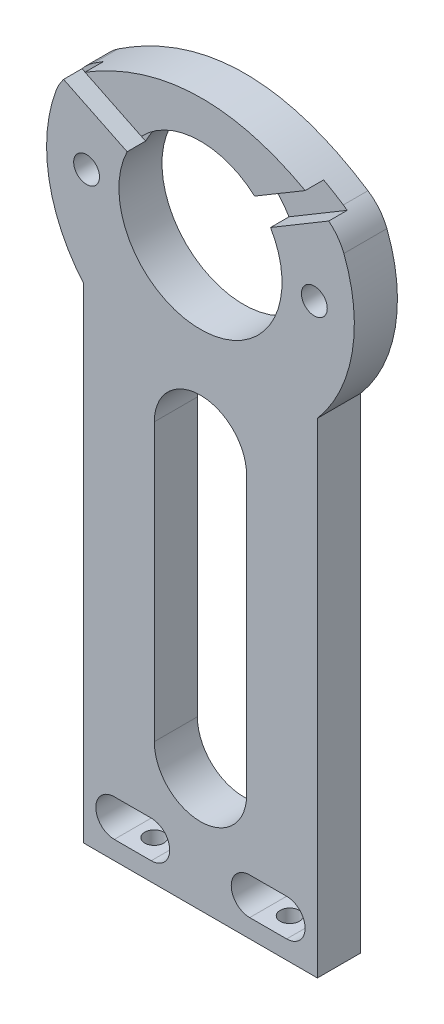
ISO-10303-21;
HEADER;
FILE_DESCRIPTION(('STEP AP214'),'2;1');
FILE_NAME('part.step','',(''),(''),'','','');
FILE_SCHEMA(('AUTOMOTIVE_DESIGN { 1 0 10303 214 1 1 1 1 }'));
ENDSEC;
DATA;
#1=APPLICATION_CONTEXT('core data for automotive mechanical design processes');
#2=APPLICATION_PROTOCOL_DEFINITION('international standard','automotive_design',2000,#1);
#3=PRODUCT_CONTEXT('',#1,'mechanical');
#4=PRODUCT('Part','Part','',(#3));
#5=PRODUCT_RELATED_PRODUCT_CATEGORY('part','',(#4));
#6=PRODUCT_DEFINITION_FORMATION('','',#4);
#7=PRODUCT_DEFINITION_CONTEXT('part definition',#1,'design');
#8=PRODUCT_DEFINITION('design','',#6,#7);
#9=PRODUCT_DEFINITION_SHAPE('','',#8);
#10=(LENGTH_UNIT() NAMED_UNIT(*) SI_UNIT(.MILLI.,.METRE.));
#11=(NAMED_UNIT(*) PLANE_ANGLE_UNIT() SI_UNIT($,.RADIAN.));
#12=(NAMED_UNIT(*) SI_UNIT($,.STERADIAN.) SOLID_ANGLE_UNIT());
#13=UNCERTAINTY_MEASURE_WITH_UNIT(LENGTH_MEASURE(1.E-05),#10,'distance_accuracy_value','');
#14=(GEOMETRIC_REPRESENTATION_CONTEXT(3) GLOBAL_UNCERTAINTY_ASSIGNED_CONTEXT((#13)) GLOBAL_UNIT_ASSIGNED_CONTEXT((#10,
#11,#12)) REPRESENTATION_CONTEXT('',''));
#15=CARTESIAN_POINT('',(0.,0.,0.));
#16=DIRECTION('',(0.,0.,1.));
#17=DIRECTION('',(1.,0.,0.));
#18=AXIS2_PLACEMENT_3D('',#15,#16,#17);
#19=CARTESIAN_POINT('',(0.,0.,3.5));
#20=DIRECTION('',(0.,0.,1.));
#21=DIRECTION('',(1.,0.,0.));
#22=AXIS2_PLACEMENT_3D('',#19,#20,#21);
#23=PLANE('',#22);
#24=CARTESIAN_POINT('',(22.1873565949359,106.520469058556,3.50000000000163));
#25=CARTESIAN_POINT('',(0.,122.446847778303,3.50000000000114));
#26=CARTESIAN_POINT('',(-22.3862924206814,106.128967232216,3.5000000000005));
#27=B_SPLINE_CURVE_WITH_KNOTS('',2,(#24,#25,#26),.UNSPECIFIED.,.F.,.F.,(3,3),(0.,1.),.UNSPECIFIED.);
#28=CARTESIAN_POINT('',(17.0104415059507,109.796186939315,3.50000000000041));
#29=VERTEX_POINT('',#28);
#30=CARTESIAN_POINT('',(-18.7508778082793,108.56712065305,3.4999999999995));
#31=VERTEX_POINT('',#30);
#32=EDGE_CURVE('E302',#29,#31,#27,.T.);
#33=ORIENTED_EDGE('',*,*,#32,.T.);
#34=DIRECTION('',(0.899289491391368,-0.43735387350869,0.));
#35=VECTOR('',#34,1.);
#36=CARTESIAN_POINT('',(39.1136510282738,80.4257089516253,3.5));
#37=LINE('',#36,#35);
#38=CARTESIAN_POINT('',(-9.61023408669528,104.121726853996,3.5));
#39=VERTEX_POINT('',#38);
#40=EDGE_CURVE('E266',#31,#39,#37,.T.);
#41=ORIENTED_EDGE('',*,*,#40,.T.);
#42=CARTESIAN_POINT('',(0.,95.,3.5));
#43=DIRECTION('',(0.,0.,1.));
#44=DIRECTION('',(1.,0.,0.));
#45=AXIS2_PLACEMENT_3D('',#42,#43,#44);
#46=CIRCLE('',#45,13.25);
#47=CARTESIAN_POINT('',(8.8023746371956,104.903570101052,3.5));
#48=VERTEX_POINT('',#47);
#49=EDGE_CURVE('E592',#48,#39,#46,.T.);
#50=ORIENTED_EDGE('',*,*,#49,.F.);
#51=DIRECTION('',(-0.858977066338456,-0.512014061823091,0.));
#52=VECTOR('',#51,1.);
#53=CARTESIAN_POINT('',(-43.8298482384317,73.5308603124188,3.5));
#54=LINE('',#53,#52);
#55=EDGE_CURVE('E309',#29,#48,#54,.T.);
#56=ORIENTED_EDGE('',*,*,#55,.F.);
#57=EDGE_LOOP('',(#33,#41,#50,#56));
#58=FACE_BOUND('',#57,.T.);
#59=ADVANCED_FACE('F63',(#58),#23,.T.);
#60=CARTESIAN_POINT('',(-18.5,95.,3.5));
#61=DIRECTION('',(0.,0.,1.));
#62=DIRECTION('',(1.,0.,0.));
#63=AXIS2_PLACEMENT_3D('',#60,#61,#62);
#64=CIRCLE('',#63,2.1);
#65=CARTESIAN_POINT('',(-16.4,95.,3.5));
#66=VERTEX_POINT('',#65);
#67=EDGE_CURVE('E492',#66,#66,#64,.T.);
#68=ORIENTED_EDGE('',*,*,#67,.F.);
#69=EDGE_LOOP('',(#68));
#70=FACE_BOUND('',#69,.T.);
#71=CARTESIAN_POINT('',(18.5,95.,3.5));
#72=DIRECTION('',(0.,0.,1.));
#73=DIRECTION('',(1.,0.,0.));
#74=AXIS2_PLACEMENT_3D('',#71,#72,#73);
#75=CIRCLE('',#74,2.1);
#76=CARTESIAN_POINT('',(20.6,95.,3.5));
#77=VERTEX_POINT('',#76);
#78=EDGE_CURVE('E649',#77,#77,#75,.T.);
#79=ORIENTED_EDGE('',*,*,#78,.F.);
#80=EDGE_LOOP('',(#79));
#81=FACE_BOUND('',#80,.T.);
#82=CARTESIAN_POINT('',(-14.,6.,3.5));
#83=DIRECTION('',(0.,0.,1.));
#84=DIRECTION('',(1.,0.,0.));
#85=AXIS2_PLACEMENT_3D('',#82,#83,#84);
#86=CIRCLE('',#85,3.);
#87=CARTESIAN_POINT('',(-14.,9.,3.5));
#88=VERTEX_POINT('',#87);
#89=CARTESIAN_POINT('',(-14.,3.,3.5));
#90=VERTEX_POINT('',#89);
#91=EDGE_CURVE('E589',#88,#90,#86,.T.);
#92=ORIENTED_EDGE('',*,*,#91,.F.);
#93=DIRECTION('',(-1.,0.,0.));
#94=VECTOR('',#93,1.);
#95=CARTESIAN_POINT('',(0.,9.00000000000001,3.5));
#96=LINE('',#95,#94);
#97=CARTESIAN_POINT('',(-8.,9.00000000000001,3.5));
#98=VERTEX_POINT('',#97);
#99=EDGE_CURVE('E586',#98,#88,#96,.T.);
#100=ORIENTED_EDGE('',*,*,#99,.F.);
#101=CARTESIAN_POINT('',(-8.,6.,3.5));
#102=DIRECTION('',(0.,0.,1.));
#103=DIRECTION('',(1.,0.,0.));
#104=AXIS2_PLACEMENT_3D('',#101,#102,#103);
#105=CIRCLE('',#104,3.);
#106=CARTESIAN_POINT('',(-8.,3.,3.5));
#107=VERTEX_POINT('',#106);
#108=EDGE_CURVE('E583',#107,#98,#105,.T.);
#109=ORIENTED_EDGE('',*,*,#108,.F.);
#110=DIRECTION('',(-1.,0.,0.));
#111=VECTOR('',#110,1.);
#112=CARTESIAN_POINT('',(0.,3.,3.5));
#113=LINE('',#112,#111);
#114=EDGE_CURVE('E581',#107,#90,#113,.T.);
#115=ORIENTED_EDGE('',*,*,#114,.T.);
#116=EDGE_LOOP('',(#92,#100,#109,#115));
#117=FACE_BOUND('',#116,.T.);
#118=DIRECTION('',(1.,0.,0.));
#119=VECTOR('',#118,1.);
#120=CARTESIAN_POINT('',(0.,9.00000000000001,3.5));
#121=LINE('',#120,#119);
#122=CARTESIAN_POINT('',(8.,9.00000000000001,3.5));
#123=VERTEX_POINT('',#122);
#124=CARTESIAN_POINT('',(14.,9.,3.5));
#125=VERTEX_POINT('',#124);
#126=EDGE_CURVE('E578',#123,#125,#121,.T.);
#127=ORIENTED_EDGE('',*,*,#126,.T.);
#128=CARTESIAN_POINT('',(14.,6.,3.5));
#129=DIRECTION('',(0.,0.,1.));
#130=DIRECTION('',(1.,0.,0.));
#131=AXIS2_PLACEMENT_3D('',#128,#129,#130);
#132=CIRCLE('',#131,3.);
#133=CARTESIAN_POINT('',(14.,3.,3.5));
#134=VERTEX_POINT('',#133);
#135=EDGE_CURVE('E576',#125,#134,#132,.F.);
#136=ORIENTED_EDGE('',*,*,#135,.T.);
#137=DIRECTION('',(1.,0.,0.));
#138=VECTOR('',#137,1.);
#139=CARTESIAN_POINT('',(0.,3.,3.5));
#140=LINE('',#139,#138);
#141=CARTESIAN_POINT('',(8.,3.,3.5));
#142=VERTEX_POINT('',#141);
#143=EDGE_CURVE('E573',#142,#134,#140,.T.);
#144=ORIENTED_EDGE('',*,*,#143,.F.);
#145=CARTESIAN_POINT('',(8.,6.,3.5));
#146=DIRECTION('',(0.,0.,1.));
#147=DIRECTION('',(1.,0.,0.));
#148=AXIS2_PLACEMENT_3D('',#145,#146,#147);
#149=CIRCLE('',#148,3.);
#150=EDGE_CURVE('E501',#142,#123,#149,.F.);
#151=ORIENTED_EDGE('',*,*,#150,.T.);
#152=EDGE_LOOP('',(#127,#136,#144,#151));
#153=FACE_BOUND('',#152,.T.);
#154=DIRECTION('',(0.,-1.,0.));
#155=VECTOR('',#154,1.);
#156=CARTESIAN_POINT('',(-7.5,65.,3.5));
#157=LINE('',#156,#155);
#158=CARTESIAN_POINT('',(-7.5,65.,3.5));
#159=VERTEX_POINT('',#158);
#160=CARTESIAN_POINT('',(-7.5,20.,3.5));
#161=VERTEX_POINT('',#160);
#162=EDGE_CURVE('E635',#159,#161,#157,.T.);
#163=ORIENTED_EDGE('',*,*,#162,.F.);
#164=CARTESIAN_POINT('',(0.,65.,3.5));
#165=DIRECTION('',(0.,0.,1.));
#166=DIRECTION('',(1.,0.,0.));
#167=AXIS2_PLACEMENT_3D('',#164,#165,#166);
#168=CIRCLE('',#167,7.5);
#169=CARTESIAN_POINT('',(-5.07645538792133,70.5208333333333,3.5));
#170=VERTEX_POINT('',#169);
#171=EDGE_CURVE('E620',#170,#159,#168,.T.);
#172=ORIENTED_EDGE('',*,*,#171,.F.);
#173=CARTESIAN_POINT('',(0.,65.,3.5));
#174=DIRECTION('',(0.,0.,1.));
#175=DIRECTION('',(1.,0.,0.));
#176=AXIS2_PLACEMENT_3D('',#173,#174,#175);
#177=CIRCLE('',#176,7.5);
#178=CARTESIAN_POINT('',(5.07645538792134,70.5208333333333,3.5));
#179=VERTEX_POINT('',#178);
#180=EDGE_CURVE('E530',#179,#170,#177,.T.);
#181=ORIENTED_EDGE('',*,*,#180,.F.);
#182=CARTESIAN_POINT('',(7.5,65.,3.5));
#183=VERTEX_POINT('',#182);
#184=EDGE_CURVE('E637',#183,#179,#168,.T.);
#185=ORIENTED_EDGE('',*,*,#184,.F.);
#186=DIRECTION('',(0.,-1.,0.));
#187=VECTOR('',#186,1.);
#188=CARTESIAN_POINT('',(7.5,65.,3.5));
#189=LINE('',#188,#187);
#190=CARTESIAN_POINT('',(7.5,20.,3.5));
#191=VERTEX_POINT('',#190);
#192=EDGE_CURVE('E616',#183,#191,#189,.T.);
#193=ORIENTED_EDGE('',*,*,#192,.T.);
#194=CARTESIAN_POINT('',(0.,20.,3.5));
#195=DIRECTION('',(0.,0.,1.));
#196=DIRECTION('',(1.,0.,0.));
#197=AXIS2_PLACEMENT_3D('',#194,#195,#196);
#198=CIRCLE('',#197,7.5);
#199=EDGE_CURVE('E633',#161,#191,#198,.T.);
#200=ORIENTED_EDGE('',*,*,#199,.F.);
#201=EDGE_LOOP('',(#163,#172,#181,#185,#193,#200));
#202=FACE_BOUND('',#201,.T.);
#203=CARTESIAN_POINT('',(-11.9155857609356,100.79493882399,3.5));
#204=VERTEX_POINT('',#203);
#205=CARTESIAN_POINT('',(11.3814461289845,101.784186319156,3.5));
#206=VERTEX_POINT('',#205);
#207=EDGE_CURVE('E593',#204,#206,#46,.T.);
#208=ORIENTED_EDGE('',*,*,#207,.F.);
#209=DIRECTION('',(-0.899289491391368,0.43735387350869,0.));
#210=VECTOR('',#209,1.);
#211=CARTESIAN_POINT('',(37.3642355342391,76.8285509860598,3.5));
#212=LINE('',#211,#210);
#213=CARTESIAN_POINT('',(-22.2386058015158,105.815360884155,3.5));
#214=VERTEX_POINT('',#213);
#215=EDGE_CURVE('E277',#204,#214,#212,.T.);
#216=ORIENTED_EDGE('',*,*,#215,.T.);
#217=CARTESIAN_POINT('',(-15.9580428559999,100.86010820771,3.5));
#218=DIRECTION('',(0.,0.,1.));
#219=DIRECTION('',(1.,0.,0.));
#220=AXIS2_PLACEMENT_3D('',#217,#218,#219);
#221=CIRCLE('',#220,8.);
#222=CARTESIAN_POINT('',(-23.4677100823527,103.617806187809,3.5));
#223=VERTEX_POINT('',#222);
#224=EDGE_CURVE('E472',#214,#223,#221,.T.);
#225=ORIENTED_EDGE('',*,*,#224,.T.);
#226=CARTESIAN_POINT('',(0.,95.,3.5));
#227=DIRECTION('',(0.,0.,1.));
#228=DIRECTION('',(1.,0.,0.));
#229=AXIS2_PLACEMENT_3D('',#226,#227,#228);
#230=CIRCLE('',#229,25.);
#231=CARTESIAN_POINT('',(-19.,78.7519231907281,3.5));
#232=VERTEX_POINT('',#231);
#233=EDGE_CURVE('E601',#223,#232,#230,.T.);
#234=ORIENTED_EDGE('',*,*,#233,.T.);
#235=DIRECTION('',(0.,-1.,0.));
#236=VECTOR('',#235,1.);
#237=CARTESIAN_POINT('',(-19.,0.,3.5));
#238=LINE('',#237,#236);
#239=CARTESIAN_POINT('',(-19.,0.,3.5));
#240=VERTEX_POINT('',#239);
#241=EDGE_CURVE('E597',#232,#240,#238,.T.);
#242=ORIENTED_EDGE('',*,*,#241,.T.);
#243=DIRECTION('',(1.,0.,0.));
#244=VECTOR('',#243,1.);
#245=CARTESIAN_POINT('',(0.,0.,3.5));
#246=LINE('',#245,#244);
#247=CARTESIAN_POINT('',(19.,0.,3.5));
#248=VERTEX_POINT('',#247);
#249=EDGE_CURVE('E595',#240,#248,#246,.T.);
#250=ORIENTED_EDGE('',*,*,#249,.T.);
#251=DIRECTION('',(0.,-1.,0.));
#252=VECTOR('',#251,1.);
#253=CARTESIAN_POINT('',(19.,0.,3.5));
#254=LINE('',#253,#252);
#255=CARTESIAN_POINT('',(19.,78.7519231907281,3.5));
#256=VERTEX_POINT('',#255);
#257=EDGE_CURVE('E602',#256,#248,#254,.T.);
#258=ORIENTED_EDGE('',*,*,#257,.F.);
#259=CARTESIAN_POINT('',(23.2921848494278,104.081526575421,3.5));
#260=VERTEX_POINT('',#259);
#261=EDGE_CURVE('E471',#256,#260,#230,.T.);
#262=ORIENTED_EDGE('',*,*,#261,.T.);
#263=CARTESIAN_POINT('',(15.8386856976108,101.175438071287,3.5));
#264=DIRECTION('',(0.,0.,1.));
#265=DIRECTION('',(1.,0.,0.));
#266=AXIS2_PLACEMENT_3D('',#263,#264,#265);
#267=CIRCLE('',#266,8.);
#268=CARTESIAN_POINT('',(20.8379935316961,107.420990182994,3.5));
#269=VERTEX_POINT('',#268);
#270=EDGE_CURVE('E71',#260,#269,#267,.T.);
#271=ORIENTED_EDGE('',*,*,#270,.T.);
#272=DIRECTION('',(0.858977066338456,0.51201406182309,0.));
#273=VECTOR('',#272,1.);
#274=CARTESIAN_POINT('',(-41.7817919911393,70.094952047065,3.5));
#275=LINE('',#274,#273);
#276=EDGE_CURVE('E324',#206,#269,#275,.T.);
#277=ORIENTED_EDGE('',*,*,#276,.F.);
#278=EDGE_LOOP('',(#208,#216,#225,#234,#242,#250,#258,#262,#271,#277));
#279=FACE_BOUND('',#278,.T.);
#280=ADVANCED_FACE('F389',(#70,#81,#117,#153,#202,#279),#23,.T.);
#281=CARTESIAN_POINT('',(0.,95.,3.5));
#282=DIRECTION('',(0.,0.,-1.));
#283=DIRECTION('',(-1.,0.,0.));
#284=AXIS2_PLACEMENT_3D('',#281,#282,#283);
#285=CYLINDRICAL_SURFACE('',#284,13.25);
#286=CARTESIAN_POINT('',(0.,95.,-3.5));
#287=DIRECTION('',(0.,0.,1.));
#288=DIRECTION('',(1.,0.,0.));
#289=AXIS2_PLACEMENT_3D('',#286,#287,#288);
#290=CIRCLE('',#289,13.25);
#291=CARTESIAN_POINT('',(13.25,95.,-3.5));
#292=VERTEX_POINT('',#291);
#293=EDGE_CURVE('E552',#292,#292,#290,.T.);
#294=ORIENTED_EDGE('',*,*,#293,.F.);
#295=EDGE_LOOP('',(#294));
#296=FACE_BOUND('',#295,.T.);
#297=ORIENTED_EDGE('',*,*,#49,.T.);
#298=DIRECTION('',(0.,0.,1.));
#299=VECTOR('',#298,1.);
#300=CARTESIAN_POINT('',(-9.61023408669528,104.121726853996,0.5));
#301=LINE('',#300,#299);
#302=CARTESIAN_POINT('',(-9.61023408669528,104.121726853996,0.5));
#303=VERTEX_POINT('',#302);
#304=EDGE_CURVE('E300',#303,#39,#301,.T.);
#305=ORIENTED_EDGE('',*,*,#304,.F.);
#306=CARTESIAN_POINT('',(0.,95.,0.5));
#307=DIRECTION('',(0.,0.,1.));
#308=DIRECTION('',(1.,0.,0.));
#309=AXIS2_PLACEMENT_3D('',#306,#307,#308);
#310=CIRCLE('',#309,13.25);
#311=CARTESIAN_POINT('',(-11.9155857609356,100.79493882399,0.5));
#312=VERTEX_POINT('',#311);
#313=EDGE_CURVE('E271',#312,#303,#310,.F.);
#314=ORIENTED_EDGE('',*,*,#313,.F.);
#315=DIRECTION('',(0.,0.,1.));
#316=VECTOR('',#315,1.);
#317=CARTESIAN_POINT('',(-11.9155857609356,100.79493882399,0.5));
#318=LINE('',#317,#316);
#319=EDGE_CURVE('E303',#312,#204,#318,.T.);
#320=ORIENTED_EDGE('',*,*,#319,.T.);
#321=ORIENTED_EDGE('',*,*,#207,.T.);
#322=DIRECTION('',(0.,0.,1.));
#323=VECTOR('',#322,1.);
#324=CARTESIAN_POINT('',(11.3814461289845,101.784186319156,0.5));
#325=LINE('',#324,#323);
#326=CARTESIAN_POINT('',(11.3814461289845,101.784186319156,0.5));
#327=VERTEX_POINT('',#326);
#328=EDGE_CURVE('E323',#327,#206,#325,.T.);
#329=ORIENTED_EDGE('',*,*,#328,.F.);
#330=CARTESIAN_POINT('',(0.,95.,0.5));
#331=DIRECTION('',(0.,0.,1.));
#332=DIRECTION('',(1.,0.,0.));
#333=AXIS2_PLACEMENT_3D('',#330,#331,#332);
#334=CIRCLE('',#333,13.25);
#335=CARTESIAN_POINT('',(8.8023746371956,104.903570101052,0.5));
#336=VERTEX_POINT('',#335);
#337=EDGE_CURVE('E307',#336,#327,#334,.F.);
#338=ORIENTED_EDGE('',*,*,#337,.F.);
#339=DIRECTION('',(0.,0.,1.));
#340=VECTOR('',#339,1.);
#341=CARTESIAN_POINT('',(8.8023746371956,104.903570101052,0.5));
#342=LINE('',#341,#340);
#343=EDGE_CURVE('E297',#336,#48,#342,.T.);
#344=ORIENTED_EDGE('',*,*,#343,.T.);
#345=EDGE_LOOP('',(#297,#305,#314,#320,#321,#329,#338,#344));
#346=FACE_BOUND('',#345,.T.);
#347=ADVANCED_FACE('F350',(#296,#346),#285,.F.);
#348=DIRECTION('',(0.,0.,-1.));
#349=VECTOR('',#348,1.);
#350=SURFACE_OF_LINEAR_EXTRUSION('',#27,#349);
#351=DIRECTION('',(0.,0.,1.));
#352=VECTOR('',#351,1.);
#353=CARTESIAN_POINT('',(-18.7508778082793,108.56712065305,0.499999999999503));
#354=LINE('',#353,#352);
#355=CARTESIAN_POINT('',(-18.7508778082793,108.56712065305,0.499999999999503));
#356=VERTEX_POINT('',#355);
#357=EDGE_CURVE('E261',#356,#31,#354,.T.);
#358=ORIENTED_EDGE('',*,*,#357,.T.);
#359=ORIENTED_EDGE('',*,*,#32,.F.);
#360=DIRECTION('',(0.,0.,1.));
#361=VECTOR('',#360,1.);
#362=CARTESIAN_POINT('',(17.0104415059507,109.796186939315,0.500000000000409));
#363=LINE('',#362,#361);
#364=CARTESIAN_POINT('',(17.0104415059507,109.796186939315,0.500000000000409));
#365=VERTEX_POINT('',#364);
#366=EDGE_CURVE('E329',#365,#29,#363,.T.);
#367=ORIENTED_EDGE('',*,*,#366,.F.);
#368=CARTESIAN_POINT('',(22.1873565949359,106.520469058556,0.500000000000524));
#369=CARTESIAN_POINT('',(0.,122.446847778303,0.500000000000038));
#370=CARTESIAN_POINT('',(-22.3862924206814,106.128967232216,0.4999999999994));
#371=B_SPLINE_CURVE_WITH_KNOTS('',2,(#368,#369,#370),.UNSPECIFIED.,.F.,.F.,(3,3),(0.,1.),.UNSPECIFIED.);
#372=CARTESIAN_POINT('',(20.2121319593355,107.874166890683,0.500000000000481));
#373=VERTEX_POINT('',#372);
#374=EDGE_CURVE('E313',#373,#365,#371,.T.);
#375=ORIENTED_EDGE('',*,*,#374,.F.);
#376=DIRECTION('',(0.,0.,-1.));
#377=VECTOR('',#376,1.);
#378=CARTESIAN_POINT('',(20.2121319593355,107.874166890683,3.50000000000158));
#379=LINE('',#378,#377);
#380=CARTESIAN_POINT('',(20.2121319593357,107.874166890683,-3.49999999999906));
#381=VERTEX_POINT('',#380);
#382=EDGE_CURVE('E481',#373,#381,#379,.T.);
#383=ORIENTED_EDGE('',*,*,#382,.T.);
#384=CARTESIAN_POINT('',(22.1873565949361,106.520469058556,-3.49999999999902));
#385=CARTESIAN_POINT('',(0.,122.446847778303,-3.4999999999995));
#386=CARTESIAN_POINT('',(-22.3862924206812,106.128967232216,-3.50000000000014));
#387=B_SPLINE_CURVE_WITH_KNOTS('',2,(#384,#385,#386),.UNSPECIFIED.,.F.,.F.,(3,3),(0.,1.),.UNSPECIFIED.);
#388=CARTESIAN_POINT('',(-20.3873387516771,107.522040199898,-3.50000000000008));
#389=VERTEX_POINT('',#388);
#390=EDGE_CURVE('E339',#389,#381,#387,.F.);
#391=ORIENTED_EDGE('',*,*,#390,.F.);
#392=DIRECTION('',(0.,0.,-1.));
#393=VECTOR('',#392,1.);
#394=CARTESIAN_POINT('',(-20.3873387516771,107.522040199898,-3.50000000000008));
#395=LINE('',#394,#393);
#396=CARTESIAN_POINT('',(-20.3873387516772,107.522040199898,0.5));
#397=VERTEX_POINT('',#396);
#398=EDGE_CURVE('E283',#389,#397,#395,.F.);
#399=ORIENTED_EDGE('',*,*,#398,.T.);
#400=CARTESIAN_POINT('',(22.1873565949359,106.520469058556,0.500000000000524));
#401=CARTESIAN_POINT('',(0.,122.446847778303,0.500000000000038));
#402=CARTESIAN_POINT('',(-22.3862924206814,106.128967232216,0.4999999999994));
#403=B_SPLINE_CURVE_WITH_KNOTS('',2,(#400,#401,#402),.UNSPECIFIED.,.F.,.F.,(3,3),(0.,1.),.UNSPECIFIED.);
#404=EDGE_CURVE('E86',#356,#397,#403,.T.);
#405=ORIENTED_EDGE('',*,*,#404,.F.);
#406=EDGE_LOOP('',(#358,#359,#367,#375,#383,#391,#399,#405));
#407=FACE_BOUND('',#406,.T.);
#408=ADVANCED_FACE('F280',(#407),#350,.F.);
#409=CARTESIAN_POINT('',(-15.9580428559998,100.86010820771,3.36430301788231E-13));
#410=DIRECTION('',(0.,0.,-1.));
#411=DIRECTION('',(-1.,0.,0.));
#412=AXIS2_PLACEMENT_3D('',#409,#410,#411);
#413=CYLINDRICAL_SURFACE('',#412,8.);
#414=ORIENTED_EDGE('',*,*,#224,.F.);
#415=DIRECTION('',(0.,0.,1.));
#416=VECTOR('',#415,1.);
#417=CARTESIAN_POINT('',(-22.2386058015158,105.815360884155,0.5));
#418=LINE('',#417,#416);
#419=CARTESIAN_POINT('',(-22.2386058015158,105.815360884155,0.5));
#420=VERTEX_POINT('',#419);
#421=EDGE_CURVE('E270',#420,#214,#418,.T.);
#422=ORIENTED_EDGE('',*,*,#421,.F.);
#423=CARTESIAN_POINT('',(-15.9580428559999,100.86010820771,0.5));
#424=DIRECTION('',(0.,0.,1.));
#425=DIRECTION('',(1.,0.,0.));
#426=AXIS2_PLACEMENT_3D('',#423,#424,#425);
#427=CIRCLE('',#426,8.);
#428=EDGE_CURVE('E284',#397,#420,#427,.T.);
#429=ORIENTED_EDGE('',*,*,#428,.F.);
#430=ORIENTED_EDGE('',*,*,#398,.F.);
#431=CARTESIAN_POINT('',(-15.9580428559997,100.86010820771,-3.5));
#432=DIRECTION('',(0.,0.,1.));
#433=DIRECTION('',(1.,0.,0.));
#434=AXIS2_PLACEMENT_3D('',#431,#432,#433);
#435=CIRCLE('',#434,8.);
#436=CARTESIAN_POINT('',(-23.4677100823527,103.617806187809,-3.5));
#437=VERTEX_POINT('',#436);
#438=EDGE_CURVE('E479',#437,#389,#435,.F.);
#439=ORIENTED_EDGE('',*,*,#438,.F.);
#440=DIRECTION('',(0.,0.,-1.));
#441=VECTOR('',#440,1.);
#442=CARTESIAN_POINT('',(-23.4677100823527,103.617806187809,3.5));
#443=LINE('',#442,#441);
#444=EDGE_CURVE('E12',#223,#437,#443,.T.);
#445=ORIENTED_EDGE('',*,*,#444,.F.);
#446=EDGE_LOOP('',(#414,#422,#429,#430,#439,#445));
#447=FACE_BOUND('',#446,.T.);
#448=ADVANCED_FACE('F65',(#447),#413,.T.);
#449=CARTESIAN_POINT('',(0.,95.,3.5));
#450=DIRECTION('',(0.,0.,-1.));
#451=DIRECTION('',(-1.,0.,0.));
#452=AXIS2_PLACEMENT_3D('',#449,#450,#451);
#453=CYLINDRICAL_SURFACE('',#452,25.);
#454=CARTESIAN_POINT('',(0.,95.,-3.5));
#455=DIRECTION('',(0.,0.,1.));
#456=DIRECTION('',(1.,0.,0.));
#457=AXIS2_PLACEMENT_3D('',#454,#455,#456);
#458=CIRCLE('',#457,25.);
#459=CARTESIAN_POINT('',(19.,78.7519231907281,-3.5));
#460=VERTEX_POINT('',#459);
#461=CARTESIAN_POINT('',(23.2921848494278,104.081526575421,-3.5));
#462=VERTEX_POINT('',#461);
#463=EDGE_CURVE('E561',#460,#462,#458,.T.);
#464=ORIENTED_EDGE('',*,*,#463,.T.);
#465=DIRECTION('',(0.,0.,-1.));
#466=VECTOR('',#465,1.);
#467=CARTESIAN_POINT('',(23.2921848494278,104.081526575421,3.5));
#468=LINE('',#467,#466);
#469=EDGE_CURVE('E473',#462,#260,#468,.F.);
#470=ORIENTED_EDGE('',*,*,#469,.T.);
#471=ORIENTED_EDGE('',*,*,#261,.F.);
#472=DIRECTION('',(0.,0.,-1.));
#473=VECTOR('',#472,1.);
#474=CARTESIAN_POINT('',(19.,78.7519231907281,3.5));
#475=LINE('',#474,#473);
#476=EDGE_CURVE('E502',#256,#460,#475,.T.);
#477=ORIENTED_EDGE('',*,*,#476,.T.);
#478=EDGE_LOOP('',(#464,#470,#471,#477));
#479=FACE_BOUND('',#478,.T.);
#480=ADVANCED_FACE('F395',(#479),#453,.T.);
#481=CARTESIAN_POINT('',(0.,0.,-3.5));
#482=DIRECTION('',(0.,0.,1.));
#483=DIRECTION('',(1.,0.,0.));
#484=AXIS2_PLACEMENT_3D('',#481,#482,#483);
#485=PLANE('',#484);
#486=CARTESIAN_POINT('',(-18.5,95.,-3.5));
#487=DIRECTION('',(0.,0.,1.));
#488=DIRECTION('',(1.,0.,0.));
#489=AXIS2_PLACEMENT_3D('',#486,#487,#488);
#490=CIRCLE('',#489,2.1);
#491=CARTESIAN_POINT('',(-16.4,95.,-3.5));
#492=VERTEX_POINT('',#491);
#493=EDGE_CURVE('E485',#492,#492,#490,.T.);
#494=ORIENTED_EDGE('',*,*,#493,.T.);
#495=EDGE_LOOP('',(#494));
#496=FACE_BOUND('',#495,.T.);
#497=CARTESIAN_POINT('',(18.5,95.,-3.5));
#498=DIRECTION('',(0.,0.,1.));
#499=DIRECTION('',(1.,0.,0.));
#500=AXIS2_PLACEMENT_3D('',#497,#498,#499);
#501=CIRCLE('',#500,2.1);
#502=CARTESIAN_POINT('',(20.6,95.,-3.5));
#503=VERTEX_POINT('',#502);
#504=EDGE_CURVE('E489',#503,#503,#501,.T.);
#505=ORIENTED_EDGE('',*,*,#504,.T.);
#506=EDGE_LOOP('',(#505));
#507=FACE_BOUND('',#506,.T.);
#508=DIRECTION('',(1.,0.,0.));
#509=VECTOR('',#508,1.);
#510=CARTESIAN_POINT('',(0.,9.00000000000001,-3.5));
#511=LINE('',#510,#509);
#512=CARTESIAN_POINT('',(8.,9.00000000000001,-3.5));
#513=VERTEX_POINT('',#512);
#514=CARTESIAN_POINT('',(14.,9.,-3.5));
#515=VERTEX_POINT('',#514);
#516=EDGE_CURVE('E537',#513,#515,#511,.T.);
#517=ORIENTED_EDGE('',*,*,#516,.F.);
#518=CARTESIAN_POINT('',(8.,6.,-3.5));
#519=DIRECTION('',(0.,0.,1.));
#520=DIRECTION('',(1.,0.,0.));
#521=AXIS2_PLACEMENT_3D('',#518,#519,#520);
#522=CIRCLE('',#521,3.);
#523=CARTESIAN_POINT('',(8.,3.,-3.5));
#524=VERTEX_POINT('',#523);
#525=EDGE_CURVE('E528',#524,#513,#522,.F.);
#526=ORIENTED_EDGE('',*,*,#525,.F.);
#527=DIRECTION('',(1.,0.,0.));
#528=VECTOR('',#527,1.);
#529=CARTESIAN_POINT('',(0.,3.,-3.5));
#530=LINE('',#529,#528);
#531=CARTESIAN_POINT('',(14.,3.,-3.5));
#532=VERTEX_POINT('',#531);
#533=EDGE_CURVE('E531',#524,#532,#530,.T.);
#534=ORIENTED_EDGE('',*,*,#533,.T.);
#535=CARTESIAN_POINT('',(14.,6.,-3.5));
#536=DIRECTION('',(0.,0.,1.));
#537=DIRECTION('',(1.,0.,0.));
#538=AXIS2_PLACEMENT_3D('',#535,#536,#537);
#539=CIRCLE('',#538,3.);
#540=EDGE_CURVE('E534',#515,#532,#539,.F.);
#541=ORIENTED_EDGE('',*,*,#540,.F.);
#542=EDGE_LOOP('',(#517,#526,#534,#541));
#543=FACE_BOUND('',#542,.T.);
#544=CARTESIAN_POINT('',(-14.,6.,-3.5));
#545=DIRECTION('',(0.,0.,1.));
#546=DIRECTION('',(1.,0.,0.));
#547=AXIS2_PLACEMENT_3D('',#544,#545,#546);
#548=CIRCLE('',#547,3.);
#549=CARTESIAN_POINT('',(-14.,9.,-3.5));
#550=VERTEX_POINT('',#549);
#551=CARTESIAN_POINT('',(-14.,3.,-3.5));
#552=VERTEX_POINT('',#551);
#553=EDGE_CURVE('E549',#550,#552,#548,.T.);
#554=ORIENTED_EDGE('',*,*,#553,.T.);
#555=DIRECTION('',(-1.,0.,0.));
#556=VECTOR('',#555,1.);
#557=CARTESIAN_POINT('',(0.,3.,-3.5));
#558=LINE('',#557,#556);
#559=CARTESIAN_POINT('',(-8.,3.,-3.5));
#560=VERTEX_POINT('',#559);
#561=EDGE_CURVE('E540',#560,#552,#558,.T.);
#562=ORIENTED_EDGE('',*,*,#561,.F.);
#563=CARTESIAN_POINT('',(-8.,6.,-3.5));
#564=DIRECTION('',(0.,0.,1.));
#565=DIRECTION('',(1.,0.,0.));
#566=AXIS2_PLACEMENT_3D('',#563,#564,#565);
#567=CIRCLE('',#566,3.);
#568=CARTESIAN_POINT('',(-8.,9.00000000000001,-3.5));
#569=VERTEX_POINT('',#568);
#570=EDGE_CURVE('E543',#560,#569,#567,.T.);
#571=ORIENTED_EDGE('',*,*,#570,.T.);
#572=DIRECTION('',(-1.,0.,0.));
#573=VECTOR('',#572,1.);
#574=CARTESIAN_POINT('',(0.,9.00000000000001,-3.5));
#575=LINE('',#574,#573);
#576=EDGE_CURVE('E546',#569,#550,#575,.T.);
#577=ORIENTED_EDGE('',*,*,#576,.T.);
#578=EDGE_LOOP('',(#554,#562,#571,#577));
#579=FACE_BOUND('',#578,.T.);
#580=ORIENTED_EDGE('',*,*,#293,.T.);
#581=EDGE_LOOP('',(#580));
#582=FACE_BOUND('',#581,.T.);
#583=ORIENTED_EDGE('',*,*,#390,.T.);
#584=CARTESIAN_POINT('',(15.838685697611,101.175438071287,-3.5));
#585=DIRECTION('',(0.,0.,1.));
#586=DIRECTION('',(1.,0.,0.));
#587=AXIS2_PLACEMENT_3D('',#584,#585,#586);
#588=CIRCLE('',#587,8.);
#589=EDGE_CURVE('E477',#381,#462,#588,.F.);
#590=ORIENTED_EDGE('',*,*,#589,.T.);
#591=ORIENTED_EDGE('',*,*,#463,.F.);
#592=DIRECTION('',(0.,-1.,0.));
#593=VECTOR('',#592,1.);
#594=CARTESIAN_POINT('',(19.,0.,-3.5));
#595=LINE('',#594,#593);
#596=CARTESIAN_POINT('',(19.,0.,-3.5));
#597=VERTEX_POINT('',#596);
#598=EDGE_CURVE('E565',#460,#597,#595,.T.);
#599=ORIENTED_EDGE('',*,*,#598,.T.);
#600=DIRECTION('',(1.,0.,0.));
#601=VECTOR('',#600,1.);
#602=CARTESIAN_POINT('',(0.,0.,-3.5));
#603=LINE('',#602,#601);
#604=CARTESIAN_POINT('',(-19.,0.,-3.5));
#605=VERTEX_POINT('',#604);
#606=EDGE_CURVE('E555',#605,#597,#603,.T.);
#607=ORIENTED_EDGE('',*,*,#606,.F.);
#608=DIRECTION('',(0.,-1.,0.));
#609=VECTOR('',#608,1.);
#610=CARTESIAN_POINT('',(-19.,0.,-3.5));
#611=LINE('',#610,#609);
#612=CARTESIAN_POINT('',(-19.,78.7519231907281,-3.5));
#613=VERTEX_POINT('',#612);
#614=EDGE_CURVE('E558',#613,#605,#611,.T.);
#615=ORIENTED_EDGE('',*,*,#614,.F.);
#616=EDGE_CURVE('E564',#437,#613,#458,.T.);
#617=ORIENTED_EDGE('',*,*,#616,.F.);
#618=ORIENTED_EDGE('',*,*,#438,.T.);
#619=EDGE_LOOP('',(#583,#590,#591,#599,#607,#615,#617,#618));
#620=FACE_BOUND('',#619,.T.);
#621=CARTESIAN_POINT('',(0.,65.,-3.5));
#622=DIRECTION('',(0.,0.,1.));
#623=DIRECTION('',(1.,0.,0.));
#624=AXIS2_PLACEMENT_3D('',#621,#622,#623);
#625=CIRCLE('',#624,7.5);
#626=CARTESIAN_POINT('',(-7.5,65.,-3.5));
#627=VERTEX_POINT('',#626);
#628=CARTESIAN_POINT('',(-5.07645538792133,70.5208333333333,-3.5));
#629=VERTEX_POINT('',#628);
#630=EDGE_CURVE('E484',#627,#629,#625,.F.);
#631=ORIENTED_EDGE('',*,*,#630,.F.);
#632=DIRECTION('',(0.,-1.,0.));
#633=VECTOR('',#632,1.);
#634=CARTESIAN_POINT('',(-7.5,65.,-3.5));
#635=LINE('',#634,#633);
#636=CARTESIAN_POINT('',(-7.5,20.,-3.5));
#637=VERTEX_POINT('',#636);
#638=EDGE_CURVE('E624',#627,#637,#635,.T.);
#639=ORIENTED_EDGE('',*,*,#638,.T.);
#640=CARTESIAN_POINT('',(0.,20.,-3.5));
#641=DIRECTION('',(0.,0.,1.));
#642=DIRECTION('',(1.,0.,0.));
#643=AXIS2_PLACEMENT_3D('',#640,#641,#642);
#644=CIRCLE('',#643,7.5);
#645=CARTESIAN_POINT('',(7.5,20.,-3.5));
#646=VERTEX_POINT('',#645);
#647=EDGE_CURVE('E621',#637,#646,#644,.T.);
#648=ORIENTED_EDGE('',*,*,#647,.T.);
#649=DIRECTION('',(0.,-1.,0.));
#650=VECTOR('',#649,1.);
#651=CARTESIAN_POINT('',(7.5,65.,-3.5));
#652=LINE('',#651,#650);
#653=CARTESIAN_POINT('',(7.5,65.,-3.5));
#654=VERTEX_POINT('',#653);
#655=EDGE_CURVE('E617',#654,#646,#652,.T.);
#656=ORIENTED_EDGE('',*,*,#655,.F.);
#657=CARTESIAN_POINT('',(0.,65.,-3.5));
#658=DIRECTION('',(0.,0.,1.));
#659=DIRECTION('',(1.,0.,0.));
#660=AXIS2_PLACEMENT_3D('',#657,#658,#659);
#661=CIRCLE('',#660,7.5);
#662=CARTESIAN_POINT('',(5.07645538792133,70.5208333333333,-3.5));
#663=VERTEX_POINT('',#662);
#664=EDGE_CURVE('E627',#654,#663,#661,.T.);
#665=ORIENTED_EDGE('',*,*,#664,.T.);
#666=CARTESIAN_POINT('',(0.,65.,-3.5));
#667=DIRECTION('',(0.,0.,1.));
#668=DIRECTION('',(1.,0.,0.));
#669=AXIS2_PLACEMENT_3D('',#666,#667,#668);
#670=CIRCLE('',#669,7.5);
#671=EDGE_CURVE('E568',#663,#629,#670,.T.);
#672=ORIENTED_EDGE('',*,*,#671,.T.);
#673=EDGE_LOOP('',(#631,#639,#648,#656,#665,#672));
#674=FACE_BOUND('',#673,.T.);
#675=ADVANCED_FACE('F391',(#496,#507,#543,#579,#582,#620,#674),#485,.F.);
#676=CARTESIAN_POINT('',(0.,9.00000000000001,3.5));
#677=DIRECTION('',(0.,1.,0.));
#678=DIRECTION('',(-1.,0.,0.));
#679=AXIS2_PLACEMENT_3D('',#676,#677,#678);
#680=PLANE('',#679);
#681=ORIENTED_EDGE('',*,*,#516,.T.);
#682=DIRECTION('',(0.,0.,-1.));
#683=VECTOR('',#682,1.);
#684=CARTESIAN_POINT('',(14.,9.,3.5));
#685=LINE('',#684,#683);
#686=EDGE_CURVE('E494',#125,#515,#685,.T.);
#687=ORIENTED_EDGE('',*,*,#686,.F.);
#688=ORIENTED_EDGE('',*,*,#126,.F.);
#689=DIRECTION('',(0.,0.,-1.));
#690=VECTOR('',#689,1.);
#691=CARTESIAN_POINT('',(8.,9.00000000000001,3.5));
#692=LINE('',#691,#690);
#693=EDGE_CURVE('E514',#123,#513,#692,.T.);
#694=ORIENTED_EDGE('',*,*,#693,.T.);
#695=EDGE_LOOP('',(#681,#687,#688,#694));
#696=FACE_BOUND('',#695,.T.);
#697=ADVANCED_FACE('F394',(#696),#680,.F.);
#698=CARTESIAN_POINT('',(14.,6.,3.5));
#699=DIRECTION('',(0.,0.,-1.));
#700=DIRECTION('',(-1.,0.,0.));
#701=AXIS2_PLACEMENT_3D('',#698,#699,#700);
#702=CYLINDRICAL_SURFACE('',#701,3.);
#703=ORIENTED_EDGE('',*,*,#540,.T.);
#704=DIRECTION('',(0.,0.,-1.));
#705=VECTOR('',#704,1.);
#706=CARTESIAN_POINT('',(14.,3.,3.5));
#707=LINE('',#706,#705);
#708=EDGE_CURVE('E522',#134,#532,#707,.T.);
#709=ORIENTED_EDGE('',*,*,#708,.F.);
#710=ORIENTED_EDGE('',*,*,#135,.F.);
#711=ORIENTED_EDGE('',*,*,#686,.T.);
#712=EDGE_LOOP('',(#703,#709,#710,#711));
#713=FACE_BOUND('',#712,.T.);
#714=ADVANCED_FACE('F406',(#713),#702,.F.);
#715=CARTESIAN_POINT('',(0.,3.,3.5));
#716=DIRECTION('',(0.,1.,0.));
#717=DIRECTION('',(-1.,0.,0.));
#718=AXIS2_PLACEMENT_3D('',#715,#716,#717);
#719=PLANE('',#718);
#720=CARTESIAN_POINT('',(11.,3.,0.));
#721=DIRECTION('',(0.,1.,0.));
#722=DIRECTION('',(-1.,0.,0.));
#723=AXIS2_PLACEMENT_3D('',#720,#721,#722);
#724=CIRCLE('',#723,1.55);
#725=CARTESIAN_POINT('',(9.45,3.,0.));
#726=VERTEX_POINT('',#725);
#727=EDGE_CURVE('E641',#726,#726,#724,.T.);
#728=ORIENTED_EDGE('',*,*,#727,.F.);
#729=EDGE_LOOP('',(#728));
#730=FACE_BOUND('',#729,.T.);
#731=ORIENTED_EDGE('',*,*,#533,.F.);
#732=DIRECTION('',(0.,0.,-1.));
#733=VECTOR('',#732,1.);
#734=CARTESIAN_POINT('',(8.,3.,3.5));
#735=LINE('',#734,#733);
#736=EDGE_CURVE('E524',#142,#524,#735,.T.);
#737=ORIENTED_EDGE('',*,*,#736,.F.);
#738=ORIENTED_EDGE('',*,*,#143,.T.);
#739=ORIENTED_EDGE('',*,*,#708,.T.);
#740=EDGE_LOOP('',(#731,#737,#738,#739));
#741=FACE_BOUND('',#740,.T.);
#742=ADVANCED_FACE('F402',(#730,#741),#719,.T.);
#743=CARTESIAN_POINT('',(-14.,6.,3.5));
#744=DIRECTION('',(0.,0.,-1.));
#745=DIRECTION('',(-1.,0.,0.));
#746=AXIS2_PLACEMENT_3D('',#743,#744,#745);
#747=CYLINDRICAL_SURFACE('',#746,3.);
#748=ORIENTED_EDGE('',*,*,#553,.F.);
#749=DIRECTION('',(0.,0.,-1.));
#750=VECTOR('',#749,1.);
#751=CARTESIAN_POINT('',(-14.,9.,3.5));
#752=LINE('',#751,#750);
#753=EDGE_CURVE('E512',#88,#550,#752,.T.);
#754=ORIENTED_EDGE('',*,*,#753,.F.);
#755=ORIENTED_EDGE('',*,*,#91,.T.);
#756=DIRECTION('',(0.,0.,-1.));
#757=VECTOR('',#756,1.);
#758=CARTESIAN_POINT('',(-14.,3.,3.5));
#759=LINE('',#758,#757);
#760=EDGE_CURVE('E504',#90,#552,#759,.T.);
#761=ORIENTED_EDGE('',*,*,#760,.T.);
#762=EDGE_LOOP('',(#748,#754,#755,#761));
#763=FACE_BOUND('',#762,.T.);
#764=ADVANCED_FACE('F405',(#763),#747,.F.);
#765=CARTESIAN_POINT('',(0.,9.00000000000001,3.5));
#766=DIRECTION('',(0.,-1.,0.));
#767=DIRECTION('',(1.,0.,0.));
#768=AXIS2_PLACEMENT_3D('',#765,#766,#767);
#769=PLANE('',#768);
#770=ORIENTED_EDGE('',*,*,#576,.F.);
#771=DIRECTION('',(0.,0.,-1.));
#772=VECTOR('',#771,1.);
#773=CARTESIAN_POINT('',(-8.,9.00000000000001,3.5));
#774=LINE('',#773,#772);
#775=EDGE_CURVE('E515',#98,#569,#774,.T.);
#776=ORIENTED_EDGE('',*,*,#775,.F.);
#777=ORIENTED_EDGE('',*,*,#99,.T.);
#778=ORIENTED_EDGE('',*,*,#753,.T.);
#779=EDGE_LOOP('',(#770,#776,#777,#778));
#780=FACE_BOUND('',#779,.T.);
#781=ADVANCED_FACE('F423',(#780),#769,.T.);
#782=CARTESIAN_POINT('',(-8.,6.,3.5));
#783=DIRECTION('',(0.,0.,-1.));
#784=DIRECTION('',(-1.,0.,0.));
#785=AXIS2_PLACEMENT_3D('',#782,#783,#784);
#786=CYLINDRICAL_SURFACE('',#785,3.);
#787=ORIENTED_EDGE('',*,*,#570,.F.);
#788=DIRECTION('',(0.,0.,-1.));
#789=VECTOR('',#788,1.);
#790=CARTESIAN_POINT('',(-8.,3.,3.5));
#791=LINE('',#790,#789);
#792=EDGE_CURVE('E517',#107,#560,#791,.T.);
#793=ORIENTED_EDGE('',*,*,#792,.F.);
#794=ORIENTED_EDGE('',*,*,#108,.T.);
#795=ORIENTED_EDGE('',*,*,#775,.T.);
#796=EDGE_LOOP('',(#787,#793,#794,#795));
#797=FACE_BOUND('',#796,.T.);
#798=ADVANCED_FACE('F419',(#797),#786,.F.);
#799=CARTESIAN_POINT('',(19.,0.,3.5));
#800=DIRECTION('',(1.,0.,0.));
#801=DIRECTION('',(0.,1.,0.));
#802=AXIS2_PLACEMENT_3D('',#799,#800,#801);
#803=PLANE('',#802);
#804=ORIENTED_EDGE('',*,*,#598,.F.);
#805=ORIENTED_EDGE('',*,*,#476,.F.);
#806=ORIENTED_EDGE('',*,*,#257,.T.);
#807=DIRECTION('',(0.,0.,-1.));
#808=VECTOR('',#807,1.);
#809=CARTESIAN_POINT('',(19.,0.,3.5));
#810=LINE('',#809,#808);
#811=EDGE_CURVE('E497',#248,#597,#810,.T.);
#812=ORIENTED_EDGE('',*,*,#811,.T.);
#813=EDGE_LOOP('',(#804,#805,#806,#812));
#814=FACE_BOUND('',#813,.T.);
#815=ADVANCED_FACE('F422',(#814),#803,.T.);
#816=ORIENTED_EDGE('',*,*,#233,.F.);
#817=ORIENTED_EDGE('',*,*,#444,.T.);
#818=ORIENTED_EDGE('',*,*,#616,.T.);
#819=DIRECTION('',(0.,0.,-1.));
#820=VECTOR('',#819,1.);
#821=CARTESIAN_POINT('',(-19.,78.7519231907281,3.5));
#822=LINE('',#821,#820);
#823=EDGE_CURVE('E505',#232,#613,#822,.T.);
#824=ORIENTED_EDGE('',*,*,#823,.F.);
#825=EDGE_LOOP('',(#816,#817,#818,#824));
#826=FACE_BOUND('',#825,.T.);
#827=ADVANCED_FACE('F440',(#826),#453,.T.);
#828=CARTESIAN_POINT('',(-19.,0.,3.5));
#829=DIRECTION('',(1.,0.,0.));
#830=DIRECTION('',(0.,1.,0.));
#831=AXIS2_PLACEMENT_3D('',#828,#829,#830);
#832=PLANE('',#831);
#833=ORIENTED_EDGE('',*,*,#614,.T.);
#834=DIRECTION('',(0.,0.,-1.));
#835=VECTOR('',#834,1.);
#836=CARTESIAN_POINT('',(-19.,0.,3.5));
#837=LINE('',#836,#835);
#838=EDGE_CURVE('E508',#240,#605,#837,.T.);
#839=ORIENTED_EDGE('',*,*,#838,.F.);
#840=ORIENTED_EDGE('',*,*,#241,.F.);
#841=ORIENTED_EDGE('',*,*,#823,.T.);
#842=EDGE_LOOP('',(#833,#839,#840,#841));
#843=FACE_BOUND('',#842,.T.);
#844=ADVANCED_FACE('F437',(#843),#832,.F.);
#845=CARTESIAN_POINT('',(0.,65.,3.5));
#846=DIRECTION('',(0.,0.,-1.));
#847=DIRECTION('',(-1.,0.,0.));
#848=AXIS2_PLACEMENT_3D('',#845,#846,#847);
#849=CYLINDRICAL_SURFACE('',#848,7.5);
#850=ORIENTED_EDGE('',*,*,#671,.F.);
#851=DIRECTION('',(0.,0.,-1.));
#852=VECTOR('',#851,1.);
#853=CARTESIAN_POINT('',(5.07645538792133,70.5208333333333,3.5));
#854=LINE('',#853,#852);
#855=EDGE_CURVE('E495',#179,#663,#854,.T.);
#856=ORIENTED_EDGE('',*,*,#855,.F.);
#857=ORIENTED_EDGE('',*,*,#180,.T.);
#858=DIRECTION('',(0.,0.,-1.));
#859=VECTOR('',#858,1.);
#860=CARTESIAN_POINT('',(-5.07645538792133,70.5208333333333,3.5));
#861=LINE('',#860,#859);
#862=EDGE_CURVE('E498',#170,#629,#861,.T.);
#863=ORIENTED_EDGE('',*,*,#862,.T.);
#864=EDGE_LOOP('',(#850,#856,#857,#863));
#865=FACE_BOUND('',#864,.T.);
#866=ADVANCED_FACE('F417',(#865),#849,.F.);
#867=CARTESIAN_POINT('',(0.,3.,3.5));
#868=DIRECTION('',(0.,-1.,0.));
#869=DIRECTION('',(1.,0.,0.));
#870=AXIS2_PLACEMENT_3D('',#867,#868,#869);
#871=PLANE('',#870);
#872=CARTESIAN_POINT('',(-11.,3.,0.));
#873=DIRECTION('',(0.,-1.,0.));
#874=DIRECTION('',(1.,0.,0.));
#875=AXIS2_PLACEMENT_3D('',#872,#873,#874);
#876=CIRCLE('',#875,1.55);
#877=CARTESIAN_POINT('',(-9.45,3.,0.));
#878=VERTEX_POINT('',#877);
#879=EDGE_CURVE('E630',#878,#878,#876,.T.);
#880=ORIENTED_EDGE('',*,*,#879,.T.);
#881=EDGE_LOOP('',(#880));
#882=FACE_BOUND('',#881,.T.);
#883=ORIENTED_EDGE('',*,*,#561,.T.);
#884=ORIENTED_EDGE('',*,*,#760,.F.);
#885=ORIENTED_EDGE('',*,*,#114,.F.);
#886=ORIENTED_EDGE('',*,*,#792,.T.);
#887=EDGE_LOOP('',(#883,#884,#885,#886));
#888=FACE_BOUND('',#887,.T.);
#889=ADVANCED_FACE('F414',(#882,#888),#871,.F.);
#890=CARTESIAN_POINT('',(0.,0.,3.5));
#891=DIRECTION('',(0.,1.,0.));
#892=DIRECTION('',(-1.,0.,0.));
#893=AXIS2_PLACEMENT_3D('',#890,#891,#892);
#894=PLANE('',#893);
#895=CARTESIAN_POINT('',(-11.,0.,0.));
#896=DIRECTION('',(0.,-1.,0.));
#897=DIRECTION('',(1.,0.,0.));
#898=AXIS2_PLACEMENT_3D('',#895,#896,#897);
#899=CIRCLE('',#898,1.55);
#900=CARTESIAN_POINT('',(-9.45,0.,0.));
#901=VERTEX_POINT('',#900);
#902=EDGE_CURVE('E644',#901,#901,#899,.T.);
#903=ORIENTED_EDGE('',*,*,#902,.F.);
#904=EDGE_LOOP('',(#903));
#905=FACE_BOUND('',#904,.T.);
#906=CARTESIAN_POINT('',(11.,0.,0.));
#907=DIRECTION('',(0.,-1.,0.));
#908=DIRECTION('',(-1.,0.,0.));
#909=AXIS2_PLACEMENT_3D('',#906,#907,#908);
#910=CIRCLE('',#909,1.55);
#911=CARTESIAN_POINT('',(9.45,0.,0.));
#912=VERTEX_POINT('',#911);
#913=EDGE_CURVE('E488',#912,#912,#910,.T.);
#914=ORIENTED_EDGE('',*,*,#913,.F.);
#915=EDGE_LOOP('',(#914));
#916=FACE_BOUND('',#915,.T.);
#917=ORIENTED_EDGE('',*,*,#606,.T.);
#918=ORIENTED_EDGE('',*,*,#811,.F.);
#919=ORIENTED_EDGE('',*,*,#249,.F.);
#920=ORIENTED_EDGE('',*,*,#838,.T.);
#921=EDGE_LOOP('',(#917,#918,#919,#920));
#922=FACE_BOUND('',#921,.T.);
#923=ADVANCED_FACE('F400',(#905,#916,#922),#894,.F.);
#924=CARTESIAN_POINT('',(8.,6.,3.5));
#925=DIRECTION('',(0.,0.,-1.));
#926=DIRECTION('',(-1.,0.,0.));
#927=AXIS2_PLACEMENT_3D('',#924,#925,#926);
#928=CYLINDRICAL_SURFACE('',#927,3.);
#929=ORIENTED_EDGE('',*,*,#525,.T.);
#930=ORIENTED_EDGE('',*,*,#693,.F.);
#931=ORIENTED_EDGE('',*,*,#150,.F.);
#932=ORIENTED_EDGE('',*,*,#736,.T.);
#933=EDGE_LOOP('',(#929,#930,#931,#932));
#934=FACE_BOUND('',#933,.T.);
#935=ADVANCED_FACE('F397',(#934),#928,.F.);
#936=CARTESIAN_POINT('',(0.,65.,3.5));
#937=DIRECTION('',(0.,0.,-1.));
#938=DIRECTION('',(-1.,0.,0.));
#939=AXIS2_PLACEMENT_3D('',#936,#937,#938);
#940=CYLINDRICAL_SURFACE('',#939,7.5);
#941=ORIENTED_EDGE('',*,*,#171,.T.);
#942=DIRECTION('',(0.,0.,-1.));
#943=VECTOR('',#942,1.);
#944=CARTESIAN_POINT('',(-7.5,65.,3.5));
#945=LINE('',#944,#943);
#946=EDGE_CURVE('E571',#159,#627,#945,.T.);
#947=ORIENTED_EDGE('',*,*,#946,.T.);
#948=ORIENTED_EDGE('',*,*,#630,.T.);
#949=ORIENTED_EDGE('',*,*,#862,.F.);
#950=EDGE_LOOP('',(#941,#947,#948,#949));
#951=FACE_BOUND('',#950,.T.);
#952=ADVANCED_FACE('F385',(#951),#940,.F.);
#953=ORIENTED_EDGE('',*,*,#664,.F.);
#954=DIRECTION('',(0.,0.,-1.));
#955=VECTOR('',#954,1.);
#956=CARTESIAN_POINT('',(7.5,65.,3.5));
#957=LINE('',#956,#955);
#958=EDGE_CURVE('E613',#183,#654,#957,.T.);
#959=ORIENTED_EDGE('',*,*,#958,.F.);
#960=ORIENTED_EDGE('',*,*,#184,.T.);
#961=ORIENTED_EDGE('',*,*,#855,.T.);
#962=EDGE_LOOP('',(#953,#959,#960,#961));
#963=FACE_BOUND('',#962,.T.);
#964=ADVANCED_FACE('F381',(#963),#940,.F.);
#965=CARTESIAN_POINT('',(-7.5,65.,3.5));
#966=DIRECTION('',(1.,0.,0.));
#967=DIRECTION('',(0.,1.,0.));
#968=AXIS2_PLACEMENT_3D('',#965,#966,#967);
#969=PLANE('',#968);
#970=ORIENTED_EDGE('',*,*,#638,.F.);
#971=ORIENTED_EDGE('',*,*,#946,.F.);
#972=ORIENTED_EDGE('',*,*,#162,.T.);
#973=DIRECTION('',(0.,0.,-1.));
#974=VECTOR('',#973,1.);
#975=CARTESIAN_POINT('',(-7.5,20.,3.5));
#976=LINE('',#975,#974);
#977=EDGE_CURVE('E609',#161,#637,#976,.T.);
#978=ORIENTED_EDGE('',*,*,#977,.T.);
#979=EDGE_LOOP('',(#970,#971,#972,#978));
#980=FACE_BOUND('',#979,.T.);
#981=ADVANCED_FACE('F377',(#980),#969,.T.);
#982=CARTESIAN_POINT('',(0.,20.,3.5));
#983=DIRECTION('',(0.,0.,-1.));
#984=DIRECTION('',(-1.,0.,0.));
#985=AXIS2_PLACEMENT_3D('',#982,#983,#984);
#986=CYLINDRICAL_SURFACE('',#985,7.5);
#987=ORIENTED_EDGE('',*,*,#647,.F.);
#988=ORIENTED_EDGE('',*,*,#977,.F.);
#989=ORIENTED_EDGE('',*,*,#199,.T.);
#990=DIRECTION('',(0.,0.,-1.));
#991=VECTOR('',#990,1.);
#992=CARTESIAN_POINT('',(7.5,20.,3.5));
#993=LINE('',#992,#991);
#994=EDGE_CURVE('E611',#191,#646,#993,.T.);
#995=ORIENTED_EDGE('',*,*,#994,.T.);
#996=EDGE_LOOP('',(#987,#988,#989,#995));
#997=FACE_BOUND('',#996,.T.);
#998=ADVANCED_FACE('F373',(#997),#986,.F.);
#999=CARTESIAN_POINT('',(7.5,65.,3.5));
#1000=DIRECTION('',(1.,0.,0.));
#1001=DIRECTION('',(0.,1.,0.));
#1002=AXIS2_PLACEMENT_3D('',#999,#1000,#1001);
#1003=PLANE('',#1002);
#1004=ORIENTED_EDGE('',*,*,#655,.T.);
#1005=ORIENTED_EDGE('',*,*,#994,.F.);
#1006=ORIENTED_EDGE('',*,*,#192,.F.);
#1007=ORIENTED_EDGE('',*,*,#958,.T.);
#1008=EDGE_LOOP('',(#1004,#1005,#1006,#1007));
#1009=FACE_BOUND('',#1008,.T.);
#1010=ADVANCED_FACE('F369',(#1009),#1003,.F.);
#1011=CARTESIAN_POINT('',(11.,5.,0.));
#1012=DIRECTION('',(0.,-1.,0.));
#1013=DIRECTION('',(1.,0.,0.));
#1014=AXIS2_PLACEMENT_3D('',#1011,#1012,#1013);
#1015=CYLINDRICAL_SURFACE('',#1014,1.55);
#1016=ORIENTED_EDGE('',*,*,#727,.T.);
#1017=EDGE_LOOP('',(#1016));
#1018=FACE_BOUND('',#1017,.T.);
#1019=ORIENTED_EDGE('',*,*,#913,.T.);
#1020=EDGE_LOOP('',(#1019));
#1021=FACE_BOUND('',#1020,.T.);
#1022=ADVANCED_FACE('F365',(#1018,#1021),#1015,.F.);
#1023=CARTESIAN_POINT('',(-11.,5.,0.));
#1024=DIRECTION('',(0.,-1.,0.));
#1025=DIRECTION('',(1.,0.,0.));
#1026=AXIS2_PLACEMENT_3D('',#1023,#1024,#1025);
#1027=CYLINDRICAL_SURFACE('',#1026,1.55);
#1028=ORIENTED_EDGE('',*,*,#902,.T.);
#1029=EDGE_LOOP('',(#1028));
#1030=FACE_BOUND('',#1029,.T.);
#1031=ORIENTED_EDGE('',*,*,#879,.F.);
#1032=EDGE_LOOP('',(#1031));
#1033=FACE_BOUND('',#1032,.T.);
#1034=ADVANCED_FACE('F361',(#1030,#1033),#1027,.F.);
#1035=CARTESIAN_POINT('',(18.5,95.,-6.5));
#1036=DIRECTION('',(0.,0.,1.));
#1037=DIRECTION('',(1.,0.,0.));
#1038=AXIS2_PLACEMENT_3D('',#1035,#1036,#1037);
#1039=CYLINDRICAL_SURFACE('',#1038,2.1);
#1040=ORIENTED_EDGE('',*,*,#78,.T.);
#1041=EDGE_LOOP('',(#1040));
#1042=FACE_BOUND('',#1041,.T.);
#1043=ORIENTED_EDGE('',*,*,#504,.F.);
#1044=EDGE_LOOP('',(#1043));
#1045=FACE_BOUND('',#1044,.T.);
#1046=ADVANCED_FACE('F357',(#1042,#1045),#1039,.F.);
#1047=CARTESIAN_POINT('',(-18.5,95.,-6.5));
#1048=DIRECTION('',(0.,0.,1.));
#1049=DIRECTION('',(1.,0.,0.));
#1050=AXIS2_PLACEMENT_3D('',#1047,#1048,#1049);
#1051=CYLINDRICAL_SURFACE('',#1050,2.1);
#1052=ORIENTED_EDGE('',*,*,#67,.T.);
#1053=EDGE_LOOP('',(#1052));
#1054=FACE_BOUND('',#1053,.T.);
#1055=ORIENTED_EDGE('',*,*,#493,.F.);
#1056=EDGE_LOOP('',(#1055));
#1057=FACE_BOUND('',#1056,.T.);
#1058=ADVANCED_FACE('F353',(#1054,#1057),#1051,.F.);
#1059=CARTESIAN_POINT('',(15.8386856976109,101.175438071287,6.93999434133137E-13));
#1060=DIRECTION('',(0.,0.,-1.));
#1061=DIRECTION('',(-1.,0.,0.));
#1062=AXIS2_PLACEMENT_3D('',#1059,#1060,#1061);
#1063=CYLINDRICAL_SURFACE('',#1062,8.);
#1064=DIRECTION('',(0.,0.,1.));
#1065=VECTOR('',#1064,1.);
#1066=CARTESIAN_POINT('',(20.8379935316961,107.420990182994,0.5));
#1067=LINE('',#1066,#1065);
#1068=CARTESIAN_POINT('',(20.8379935316961,107.420990182994,0.5));
#1069=VERTEX_POINT('',#1068);
#1070=EDGE_CURVE('E331',#1069,#269,#1067,.T.);
#1071=ORIENTED_EDGE('',*,*,#1070,.T.);
#1072=ORIENTED_EDGE('',*,*,#270,.F.);
#1073=ORIENTED_EDGE('',*,*,#469,.F.);
#1074=ORIENTED_EDGE('',*,*,#589,.F.);
#1075=ORIENTED_EDGE('',*,*,#382,.F.);
#1076=CARTESIAN_POINT('',(15.8386856976108,101.175438071287,0.5));
#1077=DIRECTION('',(0.,0.,1.));
#1078=DIRECTION('',(1.,0.,0.));
#1079=AXIS2_PLACEMENT_3D('',#1076,#1077,#1078);
#1080=CIRCLE('',#1079,8.);
#1081=EDGE_CURVE('E311',#1069,#373,#1080,.T.);
#1082=ORIENTED_EDGE('',*,*,#1081,.F.);
#1083=EDGE_LOOP('',(#1071,#1072,#1073,#1074,#1075,#1082));
#1084=FACE_BOUND('',#1083,.T.);
#1085=ADVANCED_FACE('F356',(#1084),#1063,.T.);
#1086=CARTESIAN_POINT('',(39.1136510282738,80.4257089516253,0.5));
#1087=DIRECTION('',(-0.43735387350869,-0.899289491391367,0.));
#1088=DIRECTION('',(0.899289491391368,-0.43735387350869,0.));
#1089=AXIS2_PLACEMENT_3D('',#1086,#1087,#1088);
#1090=PLANE('',#1089);
#1091=ORIENTED_EDGE('',*,*,#40,.F.);
#1092=ORIENTED_EDGE('',*,*,#357,.F.);
#1093=DIRECTION('',(0.899289491391368,-0.43735387350869,0.));
#1094=VECTOR('',#1093,1.);
#1095=CARTESIAN_POINT('',(39.1136510282738,80.4257089516253,0.5));
#1096=LINE('',#1095,#1094);
#1097=EDGE_CURVE('E263',#356,#303,#1096,.T.);
#1098=ORIENTED_EDGE('',*,*,#1097,.T.);
#1099=ORIENTED_EDGE('',*,*,#304,.T.);
#1100=EDGE_LOOP('',(#1091,#1092,#1098,#1099));
#1101=FACE_BOUND('',#1100,.T.);
#1102=ADVANCED_FACE('F262',(#1101),#1090,.T.);
#1103=CARTESIAN_POINT('',(37.3642355342391,76.8285509860598,0.5));
#1104=DIRECTION('',(0.43735387350869,0.899289491391368,0.));
#1105=DIRECTION('',(-0.899289491391368,0.43735387350869,0.));
#1106=AXIS2_PLACEMENT_3D('',#1103,#1104,#1105);
#1107=PLANE('',#1106);
#1108=ORIENTED_EDGE('',*,*,#215,.F.);
#1109=ORIENTED_EDGE('',*,*,#319,.F.);
#1110=DIRECTION('',(-0.899289491391368,0.43735387350869,0.));
#1111=VECTOR('',#1110,1.);
#1112=CARTESIAN_POINT('',(37.3642355342391,76.8285509860598,0.5));
#1113=LINE('',#1112,#1111);
#1114=EDGE_CURVE('E286',#312,#420,#1113,.T.);
#1115=ORIENTED_EDGE('',*,*,#1114,.T.);
#1116=ORIENTED_EDGE('',*,*,#421,.T.);
#1117=EDGE_LOOP('',(#1108,#1109,#1115,#1116));
#1118=FACE_BOUND('',#1117,.T.);
#1119=ADVANCED_FACE('F456',(#1118),#1107,.T.);
#1120=CARTESIAN_POINT('',(0.,0.,0.5));
#1121=DIRECTION('',(0.,0.,1.));
#1122=DIRECTION('',(1.,0.,0.));
#1123=AXIS2_PLACEMENT_3D('',#1120,#1121,#1122);
#1124=PLANE('',#1123);
#1125=ORIENTED_EDGE('',*,*,#1097,.F.);
#1126=ORIENTED_EDGE('',*,*,#404,.T.);
#1127=ORIENTED_EDGE('',*,*,#428,.T.);
#1128=ORIENTED_EDGE('',*,*,#1114,.F.);
#1129=ORIENTED_EDGE('',*,*,#313,.T.);
#1130=EDGE_LOOP('',(#1125,#1126,#1127,#1128,#1129));
#1131=FACE_BOUND('',#1130,.T.);
#1132=ADVANCED_FACE('F273',(#1131),#1124,.T.);
#1133=CARTESIAN_POINT('',(-43.8298482384317,73.5308603124188,0.5));
#1134=DIRECTION('',(-0.51201406182309,0.858977066338456,0.));
#1135=DIRECTION('',(-0.858977066338456,-0.512014061823091,0.));
#1136=AXIS2_PLACEMENT_3D('',#1133,#1134,#1135);
#1137=PLANE('',#1136);
#1138=ORIENTED_EDGE('',*,*,#55,.T.);
#1139=ORIENTED_EDGE('',*,*,#343,.F.);
#1140=DIRECTION('',(-0.858977066338456,-0.512014061823091,0.));
#1141=VECTOR('',#1140,1.);
#1142=CARTESIAN_POINT('',(-43.8298482384317,73.5308603124188,0.5));
#1143=LINE('',#1142,#1141);
#1144=EDGE_CURVE('E317',#365,#336,#1143,.T.);
#1145=ORIENTED_EDGE('',*,*,#1144,.F.);
#1146=ORIENTED_EDGE('',*,*,#366,.T.);
#1147=EDGE_LOOP('',(#1138,#1139,#1145,#1146));
#1148=FACE_BOUND('',#1147,.T.);
#1149=ADVANCED_FACE('F783',(#1148),#1137,.F.);
#1150=CARTESIAN_POINT('',(-41.7817919911393,70.094952047065,0.5));
#1151=DIRECTION('',(0.51201406182309,-0.858977066338456,0.));
#1152=DIRECTION('',(0.858977066338456,0.51201406182309,0.));
#1153=AXIS2_PLACEMENT_3D('',#1150,#1151,#1152);
#1154=PLANE('',#1153);
#1155=ORIENTED_EDGE('',*,*,#276,.T.);
#1156=ORIENTED_EDGE('',*,*,#1070,.F.);
#1157=DIRECTION('',(0.858977066338456,0.51201406182309,0.));
#1158=VECTOR('',#1157,1.);
#1159=CARTESIAN_POINT('',(-41.7817919911393,70.094952047065,0.5));
#1160=LINE('',#1159,#1158);
#1161=EDGE_CURVE('E78',#327,#1069,#1160,.T.);
#1162=ORIENTED_EDGE('',*,*,#1161,.F.);
#1163=ORIENTED_EDGE('',*,*,#328,.T.);
#1164=EDGE_LOOP('',(#1155,#1156,#1162,#1163));
#1165=FACE_BOUND('',#1164,.T.);
#1166=ADVANCED_FACE('F351',(#1165),#1154,.F.);
#1167=CARTESIAN_POINT('',(0.,0.,0.5));
#1168=DIRECTION('',(0.,0.,1.));
#1169=DIRECTION('',(1.,0.,0.));
#1170=AXIS2_PLACEMENT_3D('',#1167,#1168,#1169);
#1171=PLANE('',#1170);
#1172=ORIENTED_EDGE('',*,*,#337,.T.);
#1173=ORIENTED_EDGE('',*,*,#1161,.T.);
#1174=ORIENTED_EDGE('',*,*,#1081,.T.);
#1175=ORIENTED_EDGE('',*,*,#374,.T.);
#1176=ORIENTED_EDGE('',*,*,#1144,.T.);
#1177=EDGE_LOOP('',(#1172,#1173,#1174,#1175,#1176));
#1178=FACE_BOUND('',#1177,.T.);
#1179=ADVANCED_FACE('F800',(#1178),#1171,.T.);
#1180=CLOSED_SHELL('',(#59,#280,#347,#408,#448,#480,#675,#697,#714,#742,#764,#781,#798,#815,
#827,#844,#866,#889,#923,#935,#952,#964,#981,#998,#1010,#1022,#1034,#1046,#1058,#1085,#1102,
#1119,#1132,#1149,#1166,#1179));
#1181=MANIFOLD_SOLID_BREP('B2',#1180);
#1182=ADVANCED_BREP_SHAPE_REPRESENTATION('',(#18,#1181),#14);
#1183=SHAPE_DEFINITION_REPRESENTATION(#9,#1182);
ENDSEC;
END-ISO-10303-21;
